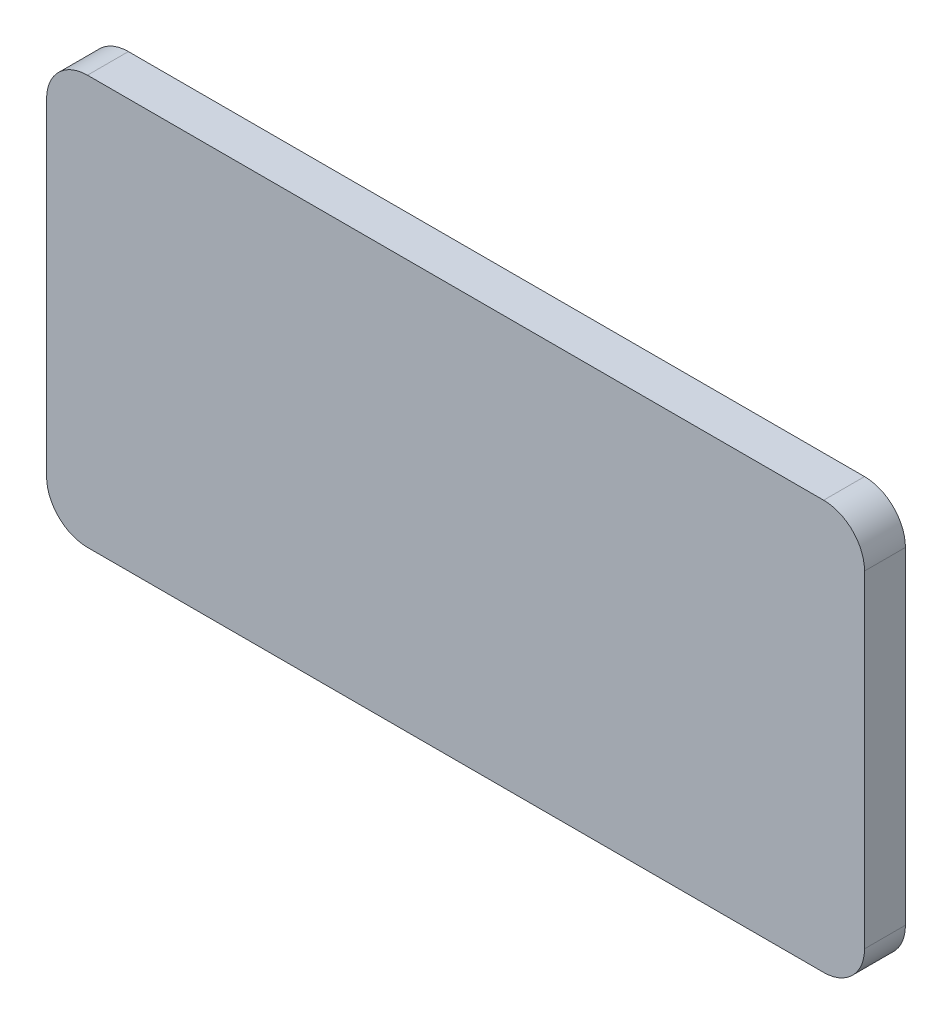
ISO-10303-21;
HEADER;
FILE_DESCRIPTION(('STEP AP214'),'2;1');
FILE_NAME('part.step','',(''),(''),'','','');
FILE_SCHEMA(('AUTOMOTIVE_DESIGN { 1 0 10303 214 1 1 1 1 }'));
ENDSEC;
DATA;
#1=APPLICATION_CONTEXT('core data for automotive mechanical design processes');
#2=APPLICATION_PROTOCOL_DEFINITION('international standard','automotive_design',2000,#1);
#3=PRODUCT_CONTEXT('',#1,'mechanical');
#4=PRODUCT('Part','Part','',(#3));
#5=PRODUCT_RELATED_PRODUCT_CATEGORY('part','',(#4));
#6=PRODUCT_DEFINITION_FORMATION('','',#4);
#7=PRODUCT_DEFINITION_CONTEXT('part definition',#1,'design');
#8=PRODUCT_DEFINITION('design','',#6,#7);
#9=PRODUCT_DEFINITION_SHAPE('','',#8);
#10=(LENGTH_UNIT() NAMED_UNIT(*) SI_UNIT(.MILLI.,.METRE.));
#11=(NAMED_UNIT(*) PLANE_ANGLE_UNIT() SI_UNIT($,.RADIAN.));
#12=(NAMED_UNIT(*) SI_UNIT($,.STERADIAN.) SOLID_ANGLE_UNIT());
#13=UNCERTAINTY_MEASURE_WITH_UNIT(LENGTH_MEASURE(1.E-05),#10,'distance_accuracy_value','');
#14=(GEOMETRIC_REPRESENTATION_CONTEXT(3) GLOBAL_UNCERTAINTY_ASSIGNED_CONTEXT((#13)) GLOBAL_UNIT_ASSIGNED_CONTEXT((#10,
#11,#12)) REPRESENTATION_CONTEXT('',''));
#15=CARTESIAN_POINT('',(0.,0.,0.));
#16=DIRECTION('',(0.,0.,1.));
#17=DIRECTION('',(1.,0.,0.));
#18=AXIS2_PLACEMENT_3D('',#15,#16,#17);
#19=CARTESIAN_POINT('',(0.,0.,5.));
#20=DIRECTION('',(-1.,0.,0.));
#21=DIRECTION('',(0.,0.,1.));
#22=AXIS2_PLACEMENT_3D('',#19,#20,#21);
#23=PLANE('',#22);
#24=DIRECTION('',(0.,1.,0.));
#25=VECTOR('',#24,1.);
#26=CARTESIAN_POINT('',(0.,0.,5.));
#27=LINE('',#26,#25);
#28=CARTESIAN_POINT('',(0.,-45.,5.));
#29=VERTEX_POINT('',#28);
#30=CARTESIAN_POINT('',(0.,-5.,5.));
#31=VERTEX_POINT('',#30);
#32=EDGE_CURVE('E121',#29,#31,#27,.T.);
#33=ORIENTED_EDGE('',*,*,#32,.F.);
#34=DIRECTION('',(0.,0.,-1.));
#35=VECTOR('',#34,1.);
#36=CARTESIAN_POINT('',(0.,-45.,5.));
#37=LINE('',#36,#35);
#38=CARTESIAN_POINT('',(0.,-45.,0.));
#39=VERTEX_POINT('',#38);
#40=EDGE_CURVE('E106',#29,#39,#37,.T.);
#41=ORIENTED_EDGE('',*,*,#40,.T.);
#42=DIRECTION('',(0.,1.,0.));
#43=VECTOR('',#42,1.);
#44=CARTESIAN_POINT('',(0.,0.,0.));
#45=LINE('',#44,#43);
#46=CARTESIAN_POINT('',(0.,-5.,0.));
#47=VERTEX_POINT('',#46);
#48=EDGE_CURVE('E118',#39,#47,#45,.T.);
#49=ORIENTED_EDGE('',*,*,#48,.T.);
#50=DIRECTION('',(0.,0.,-1.));
#51=VECTOR('',#50,1.);
#52=CARTESIAN_POINT('',(0.,-5.,5.));
#53=LINE('',#52,#51);
#54=EDGE_CURVE('E123',#47,#31,#53,.F.);
#55=ORIENTED_EDGE('',*,*,#54,.T.);
#56=EDGE_LOOP('',(#33,#41,#49,#55));
#57=FACE_BOUND('',#56,.T.);
#58=ADVANCED_FACE('F35',(#57),#23,.F.);
#59=CARTESIAN_POINT('',(0.,0.,5.));
#60=DIRECTION('',(0.,-1.,0.));
#61=DIRECTION('',(0.,0.,-1.));
#62=AXIS2_PLACEMENT_3D('',#59,#60,#61);
#63=PLANE('',#62);
#64=DIRECTION('',(-1.,0.,0.));
#65=VECTOR('',#64,1.);
#66=CARTESIAN_POINT('',(0.,0.,5.));
#67=LINE('',#66,#65);
#68=CARTESIAN_POINT('',(-5.,0.,5.));
#69=VERTEX_POINT('',#68);
#70=CARTESIAN_POINT('',(-95.,0.,5.));
#71=VERTEX_POINT('',#70);
#72=EDGE_CURVE('E161',#69,#71,#67,.T.);
#73=ORIENTED_EDGE('',*,*,#72,.F.);
#74=DIRECTION('',(0.,0.,-1.));
#75=VECTOR('',#74,1.);
#76=CARTESIAN_POINT('',(-5.,0.,5.));
#77=LINE('',#76,#75);
#78=CARTESIAN_POINT('',(-5.,0.,0.));
#79=VERTEX_POINT('',#78);
#80=EDGE_CURVE('E11',#69,#79,#77,.T.);
#81=ORIENTED_EDGE('',*,*,#80,.T.);
#82=DIRECTION('',(-1.,0.,0.));
#83=VECTOR('',#82,1.);
#84=CARTESIAN_POINT('',(0.,0.,0.));
#85=LINE('',#84,#83);
#86=CARTESIAN_POINT('',(-95.,0.,0.));
#87=VERTEX_POINT('',#86);
#88=EDGE_CURVE('E128',#79,#87,#85,.T.);
#89=ORIENTED_EDGE('',*,*,#88,.T.);
#90=DIRECTION('',(0.,0.,-1.));
#91=VECTOR('',#90,1.);
#92=CARTESIAN_POINT('',(-95.,0.,5.));
#93=LINE('',#92,#91);
#94=EDGE_CURVE('E43',#87,#71,#93,.F.);
#95=ORIENTED_EDGE('',*,*,#94,.T.);
#96=EDGE_LOOP('',(#73,#81,#89,#95));
#97=FACE_BOUND('',#96,.T.);
#98=ADVANCED_FACE('F160',(#97),#63,.F.);
#99=CARTESIAN_POINT('',(-100.,0.,5.));
#100=DIRECTION('',(1.,0.,0.));
#101=DIRECTION('',(0.,0.,-1.));
#102=AXIS2_PLACEMENT_3D('',#99,#100,#101);
#103=PLANE('',#102);
#104=DIRECTION('',(0.,-1.,0.));
#105=VECTOR('',#104,1.);
#106=CARTESIAN_POINT('',(-100.,0.,0.));
#107=LINE('',#106,#105);
#108=CARTESIAN_POINT('',(-100.,-5.,0.));
#109=VERTEX_POINT('',#108);
#110=CARTESIAN_POINT('',(-100.,-45.,0.));
#111=VERTEX_POINT('',#110);
#112=EDGE_CURVE('E131',#109,#111,#107,.T.);
#113=ORIENTED_EDGE('',*,*,#112,.T.);
#114=DIRECTION('',(0.,0.,-1.));
#115=VECTOR('',#114,1.);
#116=CARTESIAN_POINT('',(-100.,-45.,5.));
#117=LINE('',#116,#115);
#118=CARTESIAN_POINT('',(-100.,-45.,5.));
#119=VERTEX_POINT('',#118);
#120=EDGE_CURVE('E50',#111,#119,#117,.F.);
#121=ORIENTED_EDGE('',*,*,#120,.T.);
#122=DIRECTION('',(0.,-1.,0.));
#123=VECTOR('',#122,1.);
#124=CARTESIAN_POINT('',(-100.,0.,5.));
#125=LINE('',#124,#123);
#126=CARTESIAN_POINT('',(-100.,-5.,5.));
#127=VERTEX_POINT('',#126);
#128=EDGE_CURVE('E167',#127,#119,#125,.T.);
#129=ORIENTED_EDGE('',*,*,#128,.F.);
#130=DIRECTION('',(0.,0.,-1.));
#131=VECTOR('',#130,1.);
#132=CARTESIAN_POINT('',(-100.,-5.,5.));
#133=LINE('',#132,#131);
#134=EDGE_CURVE('E154',#127,#109,#133,.T.);
#135=ORIENTED_EDGE('',*,*,#134,.T.);
#136=EDGE_LOOP('',(#113,#121,#129,#135));
#137=FACE_BOUND('',#136,.T.);
#138=ADVANCED_FACE('F171',(#137),#103,.F.);
#139=CARTESIAN_POINT('',(0.,-50.,5.));
#140=DIRECTION('',(0.,1.,0.));
#141=DIRECTION('',(0.,0.,1.));
#142=AXIS2_PLACEMENT_3D('',#139,#140,#141);
#143=PLANE('',#142);
#144=DIRECTION('',(1.,0.,0.));
#145=VECTOR('',#144,1.);
#146=CARTESIAN_POINT('',(0.,-50.,0.));
#147=LINE('',#146,#145);
#148=CARTESIAN_POINT('',(-95.,-50.,0.));
#149=VERTEX_POINT('',#148);
#150=CARTESIAN_POINT('',(-5.,-50.,0.));
#151=VERTEX_POINT('',#150);
#152=EDGE_CURVE('E138',#149,#151,#147,.T.);
#153=ORIENTED_EDGE('',*,*,#152,.T.);
#154=DIRECTION('',(0.,0.,-1.));
#155=VECTOR('',#154,1.);
#156=CARTESIAN_POINT('',(-5.,-50.,5.));
#157=LINE('',#156,#155);
#158=CARTESIAN_POINT('',(-5.,-50.,5.));
#159=VERTEX_POINT('',#158);
#160=EDGE_CURVE('E107',#151,#159,#157,.F.);
#161=ORIENTED_EDGE('',*,*,#160,.T.);
#162=DIRECTION('',(1.,0.,0.));
#163=VECTOR('',#162,1.);
#164=CARTESIAN_POINT('',(0.,-50.,5.));
#165=LINE('',#164,#163);
#166=CARTESIAN_POINT('',(-95.,-50.,5.));
#167=VERTEX_POINT('',#166);
#168=EDGE_CURVE('E134',#167,#159,#165,.T.);
#169=ORIENTED_EDGE('',*,*,#168,.F.);
#170=DIRECTION('',(0.,0.,-1.));
#171=VECTOR('',#170,1.);
#172=CARTESIAN_POINT('',(-95.,-50.,5.));
#173=LINE('',#172,#171);
#174=EDGE_CURVE('E112',#167,#149,#173,.T.);
#175=ORIENTED_EDGE('',*,*,#174,.T.);
#176=EDGE_LOOP('',(#153,#161,#169,#175));
#177=FACE_BOUND('',#176,.T.);
#178=ADVANCED_FACE('F178',(#177),#143,.F.);
#179=CARTESIAN_POINT('',(0.,0.,5.));
#180=DIRECTION('',(0.,0.,-1.));
#181=DIRECTION('',(-1.,0.,0.));
#182=AXIS2_PLACEMENT_3D('',#179,#180,#181);
#183=PLANE('',#182);
#184=ORIENTED_EDGE('',*,*,#168,.T.);
#185=CARTESIAN_POINT('',(-5.,-45.,5.));
#186=DIRECTION('',(0.,0.,-1.));
#187=DIRECTION('',(-1.,0.,0.));
#188=AXIS2_PLACEMENT_3D('',#185,#186,#187);
#189=CIRCLE('',#188,5.);
#190=EDGE_CURVE('E152',#159,#29,#189,.F.);
#191=ORIENTED_EDGE('',*,*,#190,.T.);
#192=ORIENTED_EDGE('',*,*,#32,.T.);
#193=CARTESIAN_POINT('',(-5.,-5.,5.));
#194=DIRECTION('',(0.,0.,-1.));
#195=DIRECTION('',(-1.,0.,0.));
#196=AXIS2_PLACEMENT_3D('',#193,#194,#195);
#197=CIRCLE('',#196,5.);
#198=EDGE_CURVE('E148',#31,#69,#197,.F.);
#199=ORIENTED_EDGE('',*,*,#198,.T.);
#200=ORIENTED_EDGE('',*,*,#72,.T.);
#201=CARTESIAN_POINT('',(-95.,-5.,5.));
#202=DIRECTION('',(0.,0.,-1.));
#203=DIRECTION('',(-1.,0.,0.));
#204=AXIS2_PLACEMENT_3D('',#201,#202,#203);
#205=CIRCLE('',#204,5.);
#206=EDGE_CURVE('E57',#71,#127,#205,.F.);
#207=ORIENTED_EDGE('',*,*,#206,.T.);
#208=ORIENTED_EDGE('',*,*,#128,.T.);
#209=CARTESIAN_POINT('',(-95.,-45.,5.));
#210=DIRECTION('',(0.,0.,-1.));
#211=DIRECTION('',(-1.,0.,0.));
#212=AXIS2_PLACEMENT_3D('',#209,#210,#211);
#213=CIRCLE('',#212,5.);
#214=EDGE_CURVE('E150',#119,#167,#213,.F.);
#215=ORIENTED_EDGE('',*,*,#214,.T.);
#216=EDGE_LOOP('',(#184,#191,#192,#199,#200,#207,#208,#215));
#217=FACE_BOUND('',#216,.T.);
#218=ADVANCED_FACE('F165',(#217),#183,.F.);
#219=CARTESIAN_POINT('',(0.,0.,0.));
#220=DIRECTION('',(0.,0.,-1.));
#221=DIRECTION('',(-1.,0.,0.));
#222=AXIS2_PLACEMENT_3D('',#219,#220,#221);
#223=PLANE('',#222);
#224=ORIENTED_EDGE('',*,*,#48,.F.);
#225=CARTESIAN_POINT('',(-5.,-45.,0.));
#226=DIRECTION('',(0.,0.,-1.));
#227=DIRECTION('',(-1.,0.,0.));
#228=AXIS2_PLACEMENT_3D('',#225,#226,#227);
#229=CIRCLE('',#228,5.);
#230=EDGE_CURVE('E102',#39,#151,#229,.T.);
#231=ORIENTED_EDGE('',*,*,#230,.T.);
#232=ORIENTED_EDGE('',*,*,#152,.F.);
#233=CARTESIAN_POINT('',(-95.,-45.,0.));
#234=DIRECTION('',(0.,0.,-1.));
#235=DIRECTION('',(-1.,0.,0.));
#236=AXIS2_PLACEMENT_3D('',#233,#234,#235);
#237=CIRCLE('',#236,5.);
#238=EDGE_CURVE('E113',#149,#111,#237,.T.);
#239=ORIENTED_EDGE('',*,*,#238,.T.);
#240=ORIENTED_EDGE('',*,*,#112,.F.);
#241=CARTESIAN_POINT('',(-95.,-5.,0.));
#242=DIRECTION('',(0.,0.,-1.));
#243=DIRECTION('',(-1.,0.,0.));
#244=AXIS2_PLACEMENT_3D('',#241,#242,#243);
#245=CIRCLE('',#244,5.);
#246=EDGE_CURVE('E122',#109,#87,#245,.T.);
#247=ORIENTED_EDGE('',*,*,#246,.T.);
#248=ORIENTED_EDGE('',*,*,#88,.F.);
#249=CARTESIAN_POINT('',(-5.,-5.,0.));
#250=DIRECTION('',(0.,0.,-1.));
#251=DIRECTION('',(-1.,0.,0.));
#252=AXIS2_PLACEMENT_3D('',#249,#250,#251);
#253=CIRCLE('',#252,5.);
#254=EDGE_CURVE('E127',#79,#47,#253,.T.);
#255=ORIENTED_EDGE('',*,*,#254,.T.);
#256=EDGE_LOOP('',(#224,#231,#232,#239,#240,#247,#248,#255));
#257=FACE_BOUND('',#256,.T.);
#258=ADVANCED_FACE('F125',(#257),#223,.T.);
#259=CARTESIAN_POINT('',(-5.,-45.,5.));
#260=DIRECTION('',(0.,0.,-1.));
#261=DIRECTION('',(-1.,0.,0.));
#262=AXIS2_PLACEMENT_3D('',#259,#260,#261);
#263=CYLINDRICAL_SURFACE('',#262,5.);
#264=ORIENTED_EDGE('',*,*,#190,.F.);
#265=ORIENTED_EDGE('',*,*,#160,.F.);
#266=ORIENTED_EDGE('',*,*,#230,.F.);
#267=ORIENTED_EDGE('',*,*,#40,.F.);
#268=EDGE_LOOP('',(#264,#265,#266,#267));
#269=FACE_BOUND('',#268,.T.);
#270=ADVANCED_FACE('F105',(#269),#263,.T.);
#271=CARTESIAN_POINT('',(-95.,-45.,5.));
#272=DIRECTION('',(0.,0.,-1.));
#273=DIRECTION('',(-1.,0.,0.));
#274=AXIS2_PLACEMENT_3D('',#271,#272,#273);
#275=CYLINDRICAL_SURFACE('',#274,5.);
#276=ORIENTED_EDGE('',*,*,#214,.F.);
#277=ORIENTED_EDGE('',*,*,#120,.F.);
#278=ORIENTED_EDGE('',*,*,#238,.F.);
#279=ORIENTED_EDGE('',*,*,#174,.F.);
#280=EDGE_LOOP('',(#276,#277,#278,#279));
#281=FACE_BOUND('',#280,.T.);
#282=ADVANCED_FACE('F175',(#281),#275,.T.);
#283=CARTESIAN_POINT('',(-5.,-5.,5.));
#284=DIRECTION('',(0.,0.,-1.));
#285=DIRECTION('',(-1.,0.,0.));
#286=AXIS2_PLACEMENT_3D('',#283,#284,#285);
#287=CYLINDRICAL_SURFACE('',#286,5.);
#288=ORIENTED_EDGE('',*,*,#198,.F.);
#289=ORIENTED_EDGE('',*,*,#54,.F.);
#290=ORIENTED_EDGE('',*,*,#254,.F.);
#291=ORIENTED_EDGE('',*,*,#80,.F.);
#292=EDGE_LOOP('',(#288,#289,#290,#291));
#293=FACE_BOUND('',#292,.T.);
#294=ADVANCED_FACE('F181',(#293),#287,.T.);
#295=CARTESIAN_POINT('',(-95.,-5.,5.));
#296=DIRECTION('',(0.,0.,-1.));
#297=DIRECTION('',(-1.,0.,0.));
#298=AXIS2_PLACEMENT_3D('',#295,#296,#297);
#299=CYLINDRICAL_SURFACE('',#298,5.);
#300=ORIENTED_EDGE('',*,*,#206,.F.);
#301=ORIENTED_EDGE('',*,*,#94,.F.);
#302=ORIENTED_EDGE('',*,*,#246,.F.);
#303=ORIENTED_EDGE('',*,*,#134,.F.);
#304=EDGE_LOOP('',(#300,#301,#302,#303));
#305=FACE_BOUND('',#304,.T.);
#306=ADVANCED_FACE('F37',(#305),#299,.T.);
#307=CLOSED_SHELL('',(#58,#98,#138,#178,#218,#258,#270,#282,#294,#306));
#308=MANIFOLD_SOLID_BREP('B2',#307);
#309=ADVANCED_BREP_SHAPE_REPRESENTATION('',(#18,#308),#14);
#310=SHAPE_DEFINITION_REPRESENTATION(#9,#309);
ENDSEC;
END-ISO-10303-21;
